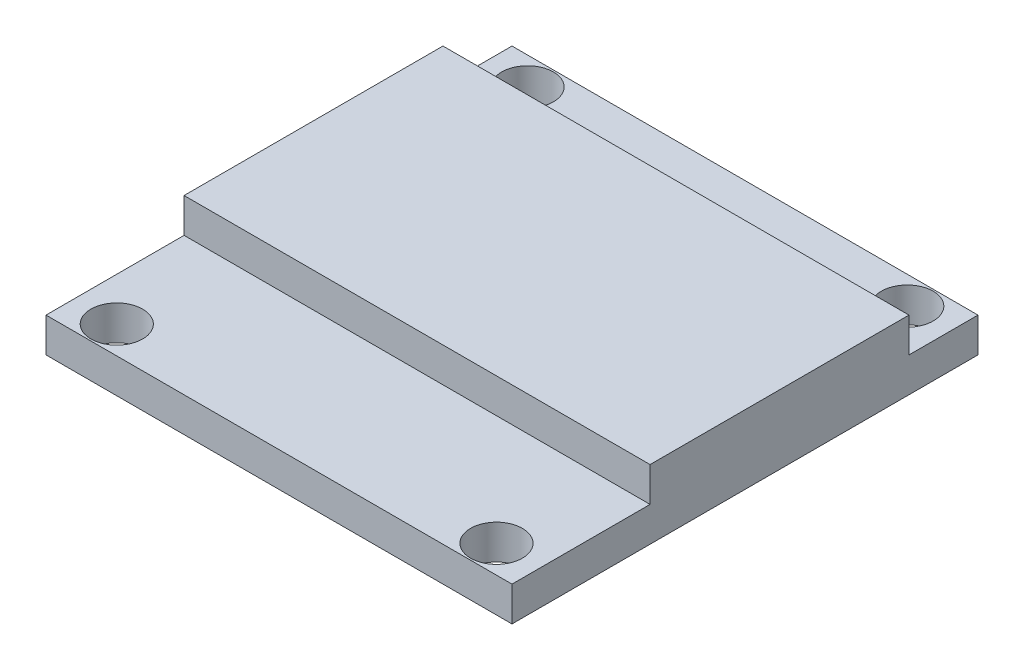
ISO-10303-21;
HEADER;
FILE_DESCRIPTION(('STEP AP214'),'2;1');
FILE_NAME('part.step','',(''),(''),'','','');
FILE_SCHEMA(('AUTOMOTIVE_DESIGN { 1 0 10303 214 1 1 1 1 }'));
ENDSEC;
DATA;
#1=APPLICATION_CONTEXT('core data for automotive mechanical design processes');
#2=APPLICATION_PROTOCOL_DEFINITION('international standard','automotive_design',2000,#1);
#3=PRODUCT_CONTEXT('',#1,'mechanical');
#4=PRODUCT('Part','Part','',(#3));
#5=PRODUCT_RELATED_PRODUCT_CATEGORY('part','',(#4));
#6=PRODUCT_DEFINITION_FORMATION('','',#4);
#7=PRODUCT_DEFINITION_CONTEXT('part definition',#1,'design');
#8=PRODUCT_DEFINITION('design','',#6,#7);
#9=PRODUCT_DEFINITION_SHAPE('','',#8);
#10=(LENGTH_UNIT() NAMED_UNIT(*) SI_UNIT(.MILLI.,.METRE.));
#11=(NAMED_UNIT(*) PLANE_ANGLE_UNIT() SI_UNIT($,.RADIAN.));
#12=(NAMED_UNIT(*) SI_UNIT($,.STERADIAN.) SOLID_ANGLE_UNIT());
#13=UNCERTAINTY_MEASURE_WITH_UNIT(LENGTH_MEASURE(1.E-05),#10,'distance_accuracy_value','');
#14=(GEOMETRIC_REPRESENTATION_CONTEXT(3) GLOBAL_UNCERTAINTY_ASSIGNED_CONTEXT((#13)) GLOBAL_UNIT_ASSIGNED_CONTEXT((#10,
#11,#12)) REPRESENTATION_CONTEXT('',''));
#15=CARTESIAN_POINT('',(0.,0.,0.));
#16=DIRECTION('',(0.,0.,1.));
#17=DIRECTION('',(1.,0.,0.));
#18=AXIS2_PLACEMENT_3D('',#15,#16,#17);
#19=CARTESIAN_POINT('',(0.,2.,0.));
#20=DIRECTION('',(0.,-1.,0.));
#21=DIRECTION('',(0.,0.,-1.));
#22=AXIS2_PLACEMENT_3D('',#19,#20,#21);
#23=PLANE('',#22);
#24=CARTESIAN_POINT('',(24.5,2.,-25.4));
#25=DIRECTION('',(0.,1.,0.));
#26=DIRECTION('',(0.,0.,-1.));
#27=AXIS2_PLACEMENT_3D('',#24,#25,#26);
#28=CIRCLE('',#27,1.5);
#29=CARTESIAN_POINT('',(24.5,2.,-26.9));
#30=VERTEX_POINT('',#29);
#31=EDGE_CURVE('E158',#30,#30,#28,.T.);
#32=ORIENTED_EDGE('',*,*,#31,.F.);
#33=EDGE_LOOP('',(#32));
#34=FACE_BOUND('',#33,.T.);
#35=CARTESIAN_POINT('',(2.5,2.,-25.4));
#36=DIRECTION('',(0.,1.,0.));
#37=DIRECTION('',(0.,0.,1.));
#38=AXIS2_PLACEMENT_3D('',#35,#36,#37);
#39=CIRCLE('',#38,1.5);
#40=CARTESIAN_POINT('',(2.5,2.,-23.9));
#41=VERTEX_POINT('',#40);
#42=EDGE_CURVE('E166',#41,#41,#39,.T.);
#43=ORIENTED_EDGE('',*,*,#42,.F.);
#44=EDGE_LOOP('',(#43));
#45=FACE_BOUND('',#44,.T.);
#46=DIRECTION('',(-1.,0.,0.));
#47=VECTOR('',#46,1.);
#48=CARTESIAN_POINT('',(0.,2.,-23.));
#49=LINE('',#48,#47);
#50=CARTESIAN_POINT('',(27.,2.,-23.));
#51=VERTEX_POINT('',#50);
#52=CARTESIAN_POINT('',(0.,2.,-23.));
#53=VERTEX_POINT('',#52);
#54=EDGE_CURVE('E59',#51,#53,#49,.T.);
#55=ORIENTED_EDGE('',*,*,#54,.F.);
#56=DIRECTION('',(0.,0.,-1.));
#57=VECTOR('',#56,1.);
#58=CARTESIAN_POINT('',(27.,2.,0.));
#59=LINE('',#58,#57);
#60=CARTESIAN_POINT('',(27.,2.,-27.));
#61=VERTEX_POINT('',#60);
#62=EDGE_CURVE('E180',#51,#61,#59,.T.);
#63=ORIENTED_EDGE('',*,*,#62,.T.);
#64=DIRECTION('',(-1.,0.,0.));
#65=VECTOR('',#64,1.);
#66=CARTESIAN_POINT('',(0.,2.,-27.));
#67=LINE('',#66,#65);
#68=CARTESIAN_POINT('',(0.,2.,-27.));
#69=VERTEX_POINT('',#68);
#70=EDGE_CURVE('E184',#61,#69,#67,.T.);
#71=ORIENTED_EDGE('',*,*,#70,.T.);
#72=DIRECTION('',(0.,0.,1.));
#73=VECTOR('',#72,1.);
#74=CARTESIAN_POINT('',(0.,2.,0.));
#75=LINE('',#74,#73);
#76=EDGE_CURVE('E174',#69,#53,#75,.T.);
#77=ORIENTED_EDGE('',*,*,#76,.T.);
#78=EDGE_LOOP('',(#55,#63,#71,#77));
#79=FACE_BOUND('',#78,.T.);
#80=ADVANCED_FACE('F43',(#34,#45,#79),#23,.F.);
#81=CARTESIAN_POINT('',(2.5,2.,-1.6));
#82=DIRECTION('',(0.,1.,0.));
#83=DIRECTION('',(0.,0.,-1.));
#84=AXIS2_PLACEMENT_3D('',#81,#82,#83);
#85=CIRCLE('',#84,1.5);
#86=CARTESIAN_POINT('',(2.5,2.,-3.1));
#87=VERTEX_POINT('',#86);
#88=EDGE_CURVE('E140',#87,#87,#85,.T.);
#89=ORIENTED_EDGE('',*,*,#88,.F.);
#90=EDGE_LOOP('',(#89));
#91=FACE_BOUND('',#90,.T.);
#92=CARTESIAN_POINT('',(24.5,2.,-1.6));
#93=DIRECTION('',(0.,1.,0.));
#94=DIRECTION('',(0.,0.,1.));
#95=AXIS2_PLACEMENT_3D('',#92,#93,#94);
#96=CIRCLE('',#95,1.5);
#97=CARTESIAN_POINT('',(24.5,2.,-0.0999999999999998));
#98=VERTEX_POINT('',#97);
#99=EDGE_CURVE('E150',#98,#98,#96,.T.);
#100=ORIENTED_EDGE('',*,*,#99,.F.);
#101=EDGE_LOOP('',(#100));
#102=FACE_BOUND('',#101,.T.);
#103=DIRECTION('',(1.,0.,0.));
#104=VECTOR('',#103,1.);
#105=CARTESIAN_POINT('',(0.,2.,-8.));
#106=LINE('',#105,#104);
#107=CARTESIAN_POINT('',(0.,2.,-8.));
#108=VERTEX_POINT('',#107);
#109=CARTESIAN_POINT('',(27.,2.,-8.));
#110=VERTEX_POINT('',#109);
#111=EDGE_CURVE('E67',#108,#110,#106,.T.);
#112=ORIENTED_EDGE('',*,*,#111,.F.);
#113=CARTESIAN_POINT('',(0.,2.,0.));
#114=VERTEX_POINT('',#113);
#115=EDGE_CURVE('E133',#108,#114,#75,.T.);
#116=ORIENTED_EDGE('',*,*,#115,.T.);
#117=DIRECTION('',(1.,0.,0.));
#118=VECTOR('',#117,1.);
#119=CARTESIAN_POINT('',(0.,2.,0.));
#120=LINE('',#119,#118);
#121=CARTESIAN_POINT('',(27.,2.,0.));
#122=VERTEX_POINT('',#121);
#123=EDGE_CURVE('E177',#114,#122,#120,.T.);
#124=ORIENTED_EDGE('',*,*,#123,.T.);
#125=EDGE_CURVE('E181',#122,#110,#59,.T.);
#126=ORIENTED_EDGE('',*,*,#125,.T.);
#127=EDGE_LOOP('',(#112,#116,#124,#126));
#128=FACE_BOUND('',#127,.T.);
#129=ADVANCED_FACE('F243',(#91,#102,#128),#23,.F.);
#130=CARTESIAN_POINT('',(0.,0.,0.));
#131=DIRECTION('',(0.,-1.,0.));
#132=DIRECTION('',(0.,0.,-1.));
#133=AXIS2_PLACEMENT_3D('',#130,#131,#132);
#134=PLANE('',#133);
#135=CARTESIAN_POINT('',(24.5,0.,-1.6));
#136=DIRECTION('',(0.,1.,0.));
#137=DIRECTION('',(0.,0.,1.));
#138=AXIS2_PLACEMENT_3D('',#135,#136,#137);
#139=CIRCLE('',#138,1.5);
#140=CARTESIAN_POINT('',(24.5,0.,-0.0999999999999998));
#141=VERTEX_POINT('',#140);
#142=EDGE_CURVE('E148',#141,#141,#139,.T.);
#143=ORIENTED_EDGE('',*,*,#142,.T.);
#144=EDGE_LOOP('',(#143));
#145=FACE_BOUND('',#144,.T.);
#146=CARTESIAN_POINT('',(2.5,0.,-25.4));
#147=DIRECTION('',(0.,1.,0.));
#148=DIRECTION('',(0.,0.,1.));
#149=AXIS2_PLACEMENT_3D('',#146,#147,#148);
#150=CIRCLE('',#149,1.5);
#151=CARTESIAN_POINT('',(2.5,0.,-23.9));
#152=VERTEX_POINT('',#151);
#153=EDGE_CURVE('E162',#152,#152,#150,.T.);
#154=ORIENTED_EDGE('',*,*,#153,.T.);
#155=EDGE_LOOP('',(#154));
#156=FACE_BOUND('',#155,.T.);
#157=DIRECTION('',(0.,0.,1.));
#158=VECTOR('',#157,1.);
#159=CARTESIAN_POINT('',(0.,0.,0.));
#160=LINE('',#159,#158);
#161=CARTESIAN_POINT('',(0.,0.,-27.));
#162=VERTEX_POINT('',#161);
#163=CARTESIAN_POINT('',(0.,0.,0.));
#164=VERTEX_POINT('',#163);
#165=EDGE_CURVE('E170',#162,#164,#160,.T.);
#166=ORIENTED_EDGE('',*,*,#165,.F.);
#167=DIRECTION('',(-1.,0.,0.));
#168=VECTOR('',#167,1.);
#169=CARTESIAN_POINT('',(0.,0.,-27.));
#170=LINE('',#169,#168);
#171=CARTESIAN_POINT('',(27.,0.,-27.));
#172=VERTEX_POINT('',#171);
#173=EDGE_CURVE('E196',#172,#162,#170,.T.);
#174=ORIENTED_EDGE('',*,*,#173,.F.);
#175=DIRECTION('',(0.,0.,-1.));
#176=VECTOR('',#175,1.);
#177=CARTESIAN_POINT('',(27.,0.,0.));
#178=LINE('',#177,#176);
#179=CARTESIAN_POINT('',(27.,0.,0.));
#180=VERTEX_POINT('',#179);
#181=EDGE_CURVE('E193',#180,#172,#178,.T.);
#182=ORIENTED_EDGE('',*,*,#181,.F.);
#183=DIRECTION('',(1.,0.,0.));
#184=VECTOR('',#183,1.);
#185=CARTESIAN_POINT('',(0.,0.,0.));
#186=LINE('',#185,#184);
#187=EDGE_CURVE('E190',#164,#180,#186,.T.);
#188=ORIENTED_EDGE('',*,*,#187,.F.);
#189=EDGE_LOOP('',(#166,#174,#182,#188));
#190=FACE_BOUND('',#189,.T.);
#191=CARTESIAN_POINT('',(24.5,0.,-25.4));
#192=DIRECTION('',(0.,1.,0.));
#193=DIRECTION('',(0.,0.,-1.));
#194=AXIS2_PLACEMENT_3D('',#191,#192,#193);
#195=CIRCLE('',#194,1.5);
#196=CARTESIAN_POINT('',(24.5,0.,-26.9));
#197=VERTEX_POINT('',#196);
#198=EDGE_CURVE('E154',#197,#197,#195,.T.);
#199=ORIENTED_EDGE('',*,*,#198,.T.);
#200=EDGE_LOOP('',(#199));
#201=FACE_BOUND('',#200,.T.);
#202=CARTESIAN_POINT('',(2.5,0.,-1.6));
#203=DIRECTION('',(0.,1.,0.));
#204=DIRECTION('',(0.,0.,-1.));
#205=AXIS2_PLACEMENT_3D('',#202,#203,#204);
#206=CIRCLE('',#205,1.5);
#207=CARTESIAN_POINT('',(2.5,0.,-3.1));
#208=VERTEX_POINT('',#207);
#209=EDGE_CURVE('E135',#208,#208,#206,.T.);
#210=ORIENTED_EDGE('',*,*,#209,.T.);
#211=EDGE_LOOP('',(#210));
#212=FACE_BOUND('',#211,.T.);
#213=ADVANCED_FACE('F218',(#145,#156,#190,#201,#212),#134,.T.);
#214=CARTESIAN_POINT('',(0.,2.,0.));
#215=DIRECTION('',(1.,0.,0.));
#216=DIRECTION('',(0.,0.,-1.));
#217=AXIS2_PLACEMENT_3D('',#214,#215,#216);
#218=PLANE('',#217);
#219=ORIENTED_EDGE('',*,*,#165,.T.);
#220=DIRECTION('',(0.,-1.,0.));
#221=VECTOR('',#220,1.);
#222=CARTESIAN_POINT('',(0.,2.,0.));
#223=LINE('',#222,#221);
#224=EDGE_CURVE('E11',#114,#164,#223,.T.);
#225=ORIENTED_EDGE('',*,*,#224,.F.);
#226=ORIENTED_EDGE('',*,*,#115,.F.);
#227=DIRECTION('',(0.,-1.,0.));
#228=VECTOR('',#227,1.);
#229=CARTESIAN_POINT('',(0.,4.,-8.));
#230=LINE('',#229,#228);
#231=CARTESIAN_POINT('',(0.,4.,-8.));
#232=VERTEX_POINT('',#231);
#233=EDGE_CURVE('E113',#232,#108,#230,.T.);
#234=ORIENTED_EDGE('',*,*,#233,.F.);
#235=DIRECTION('',(0.,0.,1.));
#236=VECTOR('',#235,1.);
#237=CARTESIAN_POINT('',(0.,4.,-23.));
#238=LINE('',#237,#236);
#239=CARTESIAN_POINT('',(0.,4.,-23.));
#240=VERTEX_POINT('',#239);
#241=EDGE_CURVE('E120',#240,#232,#238,.T.);
#242=ORIENTED_EDGE('',*,*,#241,.F.);
#243=DIRECTION('',(0.,-1.,0.));
#244=VECTOR('',#243,1.);
#245=CARTESIAN_POINT('',(0.,4.,-23.));
#246=LINE('',#245,#244);
#247=EDGE_CURVE('E225',#240,#53,#246,.T.);
#248=ORIENTED_EDGE('',*,*,#247,.T.);
#249=ORIENTED_EDGE('',*,*,#76,.F.);
#250=DIRECTION('',(0.,-1.,0.));
#251=VECTOR('',#250,1.);
#252=CARTESIAN_POINT('',(0.,2.,-27.));
#253=LINE('',#252,#251);
#254=EDGE_CURVE('E187',#69,#162,#253,.T.);
#255=ORIENTED_EDGE('',*,*,#254,.T.);
#256=EDGE_LOOP('',(#219,#225,#226,#234,#242,#248,#249,#255));
#257=FACE_BOUND('',#256,.T.);
#258=ADVANCED_FACE('F45',(#257),#218,.F.);
#259=CARTESIAN_POINT('',(0.,2.,0.));
#260=DIRECTION('',(0.,0.,-1.));
#261=DIRECTION('',(-1.,0.,0.));
#262=AXIS2_PLACEMENT_3D('',#259,#260,#261);
#263=PLANE('',#262);
#264=ORIENTED_EDGE('',*,*,#187,.T.);
#265=DIRECTION('',(0.,-1.,0.));
#266=VECTOR('',#265,1.);
#267=CARTESIAN_POINT('',(27.,2.,0.));
#268=LINE('',#267,#266);
#269=EDGE_CURVE('E52',#122,#180,#268,.T.);
#270=ORIENTED_EDGE('',*,*,#269,.F.);
#271=ORIENTED_EDGE('',*,*,#123,.F.);
#272=ORIENTED_EDGE('',*,*,#224,.T.);
#273=EDGE_LOOP('',(#264,#270,#271,#272));
#274=FACE_BOUND('',#273,.T.);
#275=ADVANCED_FACE('F244',(#274),#263,.F.);
#276=CARTESIAN_POINT('',(27.,2.,0.));
#277=DIRECTION('',(-1.,0.,0.));
#278=DIRECTION('',(0.,0.,1.));
#279=AXIS2_PLACEMENT_3D('',#276,#277,#278);
#280=PLANE('',#279);
#281=ORIENTED_EDGE('',*,*,#181,.T.);
#282=DIRECTION('',(0.,-1.,0.));
#283=VECTOR('',#282,1.);
#284=CARTESIAN_POINT('',(27.,2.,-27.));
#285=LINE('',#284,#283);
#286=EDGE_CURVE('E202',#61,#172,#285,.T.);
#287=ORIENTED_EDGE('',*,*,#286,.F.);
#288=ORIENTED_EDGE('',*,*,#62,.F.);
#289=DIRECTION('',(0.,-1.,0.));
#290=VECTOR('',#289,1.);
#291=CARTESIAN_POINT('',(27.,4.,-23.));
#292=LINE('',#291,#290);
#293=CARTESIAN_POINT('',(27.,4.,-23.));
#294=VERTEX_POINT('',#293);
#295=EDGE_CURVE('E142',#294,#51,#292,.T.);
#296=ORIENTED_EDGE('',*,*,#295,.F.);
#297=DIRECTION('',(0.,0.,-1.));
#298=VECTOR('',#297,1.);
#299=CARTESIAN_POINT('',(27.,4.,-23.));
#300=LINE('',#299,#298);
#301=CARTESIAN_POINT('',(27.,4.,-8.));
#302=VERTEX_POINT('',#301);
#303=EDGE_CURVE('E119',#302,#294,#300,.T.);
#304=ORIENTED_EDGE('',*,*,#303,.F.);
#305=DIRECTION('',(0.,-1.,0.));
#306=VECTOR('',#305,1.);
#307=CARTESIAN_POINT('',(27.,4.,-8.));
#308=LINE('',#307,#306);
#309=EDGE_CURVE('E115',#302,#110,#308,.T.);
#310=ORIENTED_EDGE('',*,*,#309,.T.);
#311=ORIENTED_EDGE('',*,*,#125,.F.);
#312=ORIENTED_EDGE('',*,*,#269,.T.);
#313=EDGE_LOOP('',(#281,#287,#288,#296,#304,#310,#311,#312));
#314=FACE_BOUND('',#313,.T.);
#315=ADVANCED_FACE('F211',(#314),#280,.F.);
#316=CARTESIAN_POINT('',(0.,2.,-27.));
#317=DIRECTION('',(0.,0.,1.));
#318=DIRECTION('',(1.,0.,0.));
#319=AXIS2_PLACEMENT_3D('',#316,#317,#318);
#320=PLANE('',#319);
#321=ORIENTED_EDGE('',*,*,#173,.T.);
#322=ORIENTED_EDGE('',*,*,#254,.F.);
#323=ORIENTED_EDGE('',*,*,#70,.F.);
#324=ORIENTED_EDGE('',*,*,#286,.T.);
#325=EDGE_LOOP('',(#321,#322,#323,#324));
#326=FACE_BOUND('',#325,.T.);
#327=ADVANCED_FACE('F222',(#326),#320,.F.);
#328=CARTESIAN_POINT('',(2.5,2.,-25.4));
#329=DIRECTION('',(0.,-1.,0.));
#330=DIRECTION('',(0.,0.,-1.));
#331=AXIS2_PLACEMENT_3D('',#328,#329,#330);
#332=CYLINDRICAL_SURFACE('',#331,1.5);
#333=ORIENTED_EDGE('',*,*,#42,.T.);
#334=EDGE_LOOP('',(#333));
#335=FACE_BOUND('',#334,.T.);
#336=ORIENTED_EDGE('',*,*,#153,.F.);
#337=EDGE_LOOP('',(#336));
#338=FACE_BOUND('',#337,.T.);
#339=ADVANCED_FACE('F262',(#335,#338),#332,.F.);
#340=CARTESIAN_POINT('',(24.5,2.,-25.4));
#341=DIRECTION('',(0.,-1.,0.));
#342=DIRECTION('',(0.,0.,-1.));
#343=AXIS2_PLACEMENT_3D('',#340,#341,#342);
#344=CYLINDRICAL_SURFACE('',#343,1.5);
#345=ORIENTED_EDGE('',*,*,#31,.T.);
#346=EDGE_LOOP('',(#345));
#347=FACE_BOUND('',#346,.T.);
#348=ORIENTED_EDGE('',*,*,#198,.F.);
#349=EDGE_LOOP('',(#348));
#350=FACE_BOUND('',#349,.T.);
#351=ADVANCED_FACE('F271',(#347,#350),#344,.F.);
#352=CARTESIAN_POINT('',(24.5,2.,-1.6));
#353=DIRECTION('',(0.,-1.,0.));
#354=DIRECTION('',(0.,0.,-1.));
#355=AXIS2_PLACEMENT_3D('',#352,#353,#354);
#356=CYLINDRICAL_SURFACE('',#355,1.5);
#357=ORIENTED_EDGE('',*,*,#99,.T.);
#358=EDGE_LOOP('',(#357));
#359=FACE_BOUND('',#358,.T.);
#360=ORIENTED_EDGE('',*,*,#142,.F.);
#361=EDGE_LOOP('',(#360));
#362=FACE_BOUND('',#361,.T.);
#363=ADVANCED_FACE('F276',(#359,#362),#356,.F.);
#364=CARTESIAN_POINT('',(2.5,2.,-1.6));
#365=DIRECTION('',(0.,-1.,0.));
#366=DIRECTION('',(0.,0.,-1.));
#367=AXIS2_PLACEMENT_3D('',#364,#365,#366);
#368=CYLINDRICAL_SURFACE('',#367,1.5);
#369=ORIENTED_EDGE('',*,*,#88,.T.);
#370=EDGE_LOOP('',(#369));
#371=FACE_BOUND('',#370,.T.);
#372=ORIENTED_EDGE('',*,*,#209,.F.);
#373=EDGE_LOOP('',(#372));
#374=FACE_BOUND('',#373,.T.);
#375=ADVANCED_FACE('F285',(#371,#374),#368,.F.);
#376=CARTESIAN_POINT('',(0.,4.,-8.));
#377=DIRECTION('',(0.,0.,-1.));
#378=DIRECTION('',(-1.,0.,0.));
#379=AXIS2_PLACEMENT_3D('',#376,#377,#378);
#380=PLANE('',#379);
#381=ORIENTED_EDGE('',*,*,#111,.T.);
#382=ORIENTED_EDGE('',*,*,#309,.F.);
#383=DIRECTION('',(1.,0.,0.));
#384=VECTOR('',#383,1.);
#385=CARTESIAN_POINT('',(0.,4.,-8.));
#386=LINE('',#385,#384);
#387=EDGE_CURVE('E109',#232,#302,#386,.T.);
#388=ORIENTED_EDGE('',*,*,#387,.F.);
#389=ORIENTED_EDGE('',*,*,#233,.T.);
#390=EDGE_LOOP('',(#381,#382,#388,#389));
#391=FACE_BOUND('',#390,.T.);
#392=ADVANCED_FACE('F111',(#391),#380,.F.);
#393=CARTESIAN_POINT('',(0.,4.,-23.));
#394=DIRECTION('',(0.,0.,1.));
#395=DIRECTION('',(1.,0.,0.));
#396=AXIS2_PLACEMENT_3D('',#393,#394,#395);
#397=PLANE('',#396);
#398=ORIENTED_EDGE('',*,*,#54,.T.);
#399=ORIENTED_EDGE('',*,*,#247,.F.);
#400=DIRECTION('',(-1.,0.,0.));
#401=VECTOR('',#400,1.);
#402=CARTESIAN_POINT('',(0.,4.,-23.));
#403=LINE('',#402,#401);
#404=EDGE_CURVE('E125',#294,#240,#403,.T.);
#405=ORIENTED_EDGE('',*,*,#404,.F.);
#406=ORIENTED_EDGE('',*,*,#295,.T.);
#407=EDGE_LOOP('',(#398,#399,#405,#406));
#408=FACE_BOUND('',#407,.T.);
#409=ADVANCED_FACE('F228',(#408),#397,.F.);
#410=CARTESIAN_POINT('',(0.,4.,0.));
#411=DIRECTION('',(0.,1.,0.));
#412=DIRECTION('',(0.,0.,1.));
#413=AXIS2_PLACEMENT_3D('',#410,#411,#412);
#414=PLANE('',#413);
#415=ORIENTED_EDGE('',*,*,#241,.T.);
#416=ORIENTED_EDGE('',*,*,#387,.T.);
#417=ORIENTED_EDGE('',*,*,#303,.T.);
#418=ORIENTED_EDGE('',*,*,#404,.T.);
#419=EDGE_LOOP('',(#415,#416,#417,#418));
#420=FACE_BOUND('',#419,.T.);
#421=ADVANCED_FACE('F123',(#420),#414,.T.);
#422=CLOSED_SHELL('',(#80,#129,#213,#258,#275,#315,#327,#339,#351,#363,#375,#392,#409,#421));
#423=MANIFOLD_SOLID_BREP('B2',#422);
#424=ADVANCED_BREP_SHAPE_REPRESENTATION('',(#18,#423),#14);
#425=SHAPE_DEFINITION_REPRESENTATION(#9,#424);
ENDSEC;
END-ISO-10303-21;
